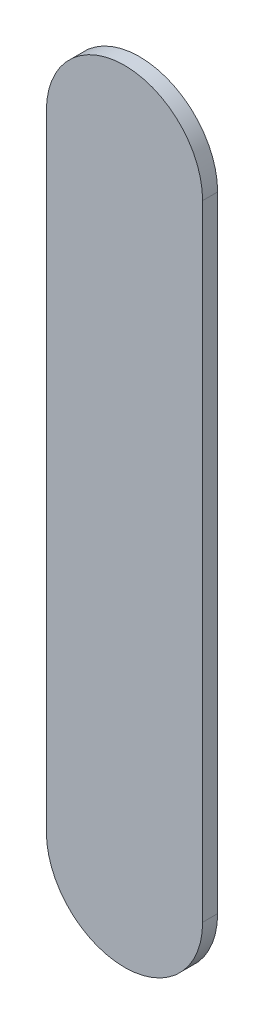
ISO-10303-21;
HEADER;
FILE_DESCRIPTION(('STEP AP214'),'2;1');
FILE_NAME('part.step','',(''),(''),'','','');
FILE_SCHEMA(('AUTOMOTIVE_DESIGN { 1 0 10303 214 1 1 1 1 }'));
ENDSEC;
DATA;
#1=APPLICATION_CONTEXT('core data for automotive mechanical design processes');
#2=APPLICATION_PROTOCOL_DEFINITION('international standard','automotive_design',2000,#1);
#3=PRODUCT_CONTEXT('',#1,'mechanical');
#4=PRODUCT('Part','Part','',(#3));
#5=PRODUCT_RELATED_PRODUCT_CATEGORY('part','',(#4));
#6=PRODUCT_DEFINITION_FORMATION('','',#4);
#7=PRODUCT_DEFINITION_CONTEXT('part definition',#1,'design');
#8=PRODUCT_DEFINITION('design','',#6,#7);
#9=PRODUCT_DEFINITION_SHAPE('','',#8);
#10=(LENGTH_UNIT() NAMED_UNIT(*) SI_UNIT(.MILLI.,.METRE.));
#11=(NAMED_UNIT(*) PLANE_ANGLE_UNIT() SI_UNIT($,.RADIAN.));
#12=(NAMED_UNIT(*) SI_UNIT($,.STERADIAN.) SOLID_ANGLE_UNIT());
#13=UNCERTAINTY_MEASURE_WITH_UNIT(LENGTH_MEASURE(1.E-05),#10,'distance_accuracy_value','');
#14=(GEOMETRIC_REPRESENTATION_CONTEXT(3) GLOBAL_UNCERTAINTY_ASSIGNED_CONTEXT((#13)) GLOBAL_UNIT_ASSIGNED_CONTEXT((#10,
#11,#12)) REPRESENTATION_CONTEXT('',''));
#15=CARTESIAN_POINT('',(0.,0.,0.));
#16=DIRECTION('',(0.,0.,1.));
#17=DIRECTION('',(1.,0.,0.));
#18=AXIS2_PLACEMENT_3D('',#15,#16,#17);
#19=CARTESIAN_POINT('',(0.,12.7,0.6096));
#20=DIRECTION('',(0.,0.,-1.));
#21=DIRECTION('',(-1.,0.,0.));
#22=AXIS2_PLACEMENT_3D('',#19,#20,#21);
#23=CYLINDRICAL_SURFACE('',#22,3.175);
#24=CARTESIAN_POINT('',(0.,12.7,0.));
#25=DIRECTION('',(0.,0.,1.));
#26=DIRECTION('',(1.,0.,0.));
#27=AXIS2_PLACEMENT_3D('',#24,#25,#26);
#28=CIRCLE('',#27,3.175);
#29=CARTESIAN_POINT('',(3.17499999999999,12.7,0.));
#30=VERTEX_POINT('',#29);
#31=CARTESIAN_POINT('',(-3.175,12.7,0.));
#32=VERTEX_POINT('',#31);
#33=EDGE_CURVE('E107',#30,#32,#28,.T.);
#34=ORIENTED_EDGE('',*,*,#33,.T.);
#35=DIRECTION('',(0.,0.,-1.));
#36=VECTOR('',#35,1.);
#37=CARTESIAN_POINT('',(-3.175,12.7,0.6096));
#38=LINE('',#37,#36);
#39=CARTESIAN_POINT('',(-3.175,12.7,0.6096));
#40=VERTEX_POINT('',#39);
#41=EDGE_CURVE('E13',#40,#32,#38,.T.);
#42=ORIENTED_EDGE('',*,*,#41,.F.);
#43=CARTESIAN_POINT('',(0.,12.7,0.6096));
#44=DIRECTION('',(0.,0.,1.));
#45=DIRECTION('',(1.,0.,0.));
#46=AXIS2_PLACEMENT_3D('',#43,#44,#45);
#47=CIRCLE('',#46,3.175);
#48=CARTESIAN_POINT('',(3.17499999999999,12.7,0.6096));
#49=VERTEX_POINT('',#48);
#50=EDGE_CURVE('E95',#49,#40,#47,.T.);
#51=ORIENTED_EDGE('',*,*,#50,.F.);
#52=DIRECTION('',(0.,0.,-1.));
#53=VECTOR('',#52,1.);
#54=CARTESIAN_POINT('',(3.17499999999999,12.7,0.6096));
#55=LINE('',#54,#53);
#56=EDGE_CURVE('E103',#49,#30,#55,.T.);
#57=ORIENTED_EDGE('',*,*,#56,.T.);
#58=EDGE_LOOP('',(#34,#42,#51,#57));
#59=FACE_BOUND('',#58,.T.);
#60=ADVANCED_FACE('F44',(#59),#23,.T.);
#61=CARTESIAN_POINT('',(-3.175,12.7,0.6096));
#62=DIRECTION('',(1.,0.,0.));
#63=DIRECTION('',(0.,1.,0.));
#64=AXIS2_PLACEMENT_3D('',#61,#62,#63);
#65=PLANE('',#64);
#66=DIRECTION('',(0.,-1.,0.));
#67=VECTOR('',#66,1.);
#68=CARTESIAN_POINT('',(-3.175,12.7,0.));
#69=LINE('',#68,#67);
#70=CARTESIAN_POINT('',(-3.175,-12.7,0.));
#71=VERTEX_POINT('',#70);
#72=EDGE_CURVE('E99',#32,#71,#69,.T.);
#73=ORIENTED_EDGE('',*,*,#72,.T.);
#74=DIRECTION('',(0.,0.,-1.));
#75=VECTOR('',#74,1.);
#76=CARTESIAN_POINT('',(-3.175,-12.7,0.6096));
#77=LINE('',#76,#75);
#78=CARTESIAN_POINT('',(-3.175,-12.7,0.6096));
#79=VERTEX_POINT('',#78);
#80=EDGE_CURVE('E52',#79,#71,#77,.T.);
#81=ORIENTED_EDGE('',*,*,#80,.F.);
#82=DIRECTION('',(0.,-1.,0.));
#83=VECTOR('',#82,1.);
#84=CARTESIAN_POINT('',(-3.175,12.7,0.6096));
#85=LINE('',#84,#83);
#86=EDGE_CURVE('E90',#40,#79,#85,.T.);
#87=ORIENTED_EDGE('',*,*,#86,.F.);
#88=ORIENTED_EDGE('',*,*,#41,.T.);
#89=EDGE_LOOP('',(#73,#81,#87,#88));
#90=FACE_BOUND('',#89,.T.);
#91=ADVANCED_FACE('F98',(#90),#65,.F.);
#92=CARTESIAN_POINT('',(0.,-12.7,0.6096));
#93=DIRECTION('',(0.,0.,-1.));
#94=DIRECTION('',(-1.,0.,0.));
#95=AXIS2_PLACEMENT_3D('',#92,#93,#94);
#96=CYLINDRICAL_SURFACE('',#95,3.175);
#97=CARTESIAN_POINT('',(0.,-12.7,0.));
#98=DIRECTION('',(0.,0.,1.));
#99=DIRECTION('',(1.,0.,0.));
#100=AXIS2_PLACEMENT_3D('',#97,#98,#99);
#101=CIRCLE('',#100,3.175);
#102=CARTESIAN_POINT('',(3.175,-12.7,0.));
#103=VERTEX_POINT('',#102);
#104=EDGE_CURVE('E77',#71,#103,#101,.T.);
#105=ORIENTED_EDGE('',*,*,#104,.T.);
#106=DIRECTION('',(0.,0.,-1.));
#107=VECTOR('',#106,1.);
#108=CARTESIAN_POINT('',(3.175,-12.7,0.6096));
#109=LINE('',#108,#107);
#110=CARTESIAN_POINT('',(3.175,-12.7,0.6096));
#111=VERTEX_POINT('',#110);
#112=EDGE_CURVE('E100',#111,#103,#109,.T.);
#113=ORIENTED_EDGE('',*,*,#112,.F.);
#114=CARTESIAN_POINT('',(0.,-12.7,0.6096));
#115=DIRECTION('',(0.,0.,1.));
#116=DIRECTION('',(1.,0.,0.));
#117=AXIS2_PLACEMENT_3D('',#114,#115,#116);
#118=CIRCLE('',#117,3.175);
#119=EDGE_CURVE('E93',#79,#111,#118,.T.);
#120=ORIENTED_EDGE('',*,*,#119,.F.);
#121=ORIENTED_EDGE('',*,*,#80,.T.);
#122=EDGE_LOOP('',(#105,#113,#120,#121));
#123=FACE_BOUND('',#122,.T.);
#124=ADVANCED_FACE('F101',(#123),#96,.T.);
#125=CARTESIAN_POINT('',(3.17499999999999,12.7,0.6096));
#126=DIRECTION('',(-1.,0.,0.));
#127=DIRECTION('',(0.,-1.,0.));
#128=AXIS2_PLACEMENT_3D('',#125,#126,#127);
#129=PLANE('',#128);
#130=DIRECTION('',(0.,1.,0.));
#131=VECTOR('',#130,1.);
#132=CARTESIAN_POINT('',(3.17499999999999,12.7,0.));
#133=LINE('',#132,#131);
#134=EDGE_CURVE('E83',#103,#30,#133,.T.);
#135=ORIENTED_EDGE('',*,*,#134,.T.);
#136=ORIENTED_EDGE('',*,*,#56,.F.);
#137=DIRECTION('',(0.,1.,0.));
#138=VECTOR('',#137,1.);
#139=CARTESIAN_POINT('',(3.17499999999999,12.7,0.6096));
#140=LINE('',#139,#138);
#141=EDGE_CURVE('E60',#111,#49,#140,.T.);
#142=ORIENTED_EDGE('',*,*,#141,.F.);
#143=ORIENTED_EDGE('',*,*,#112,.T.);
#144=EDGE_LOOP('',(#135,#136,#142,#143));
#145=FACE_BOUND('',#144,.T.);
#146=ADVANCED_FACE('F114',(#145),#129,.F.);
#147=CARTESIAN_POINT('',(0.,12.7,0.6096));
#148=DIRECTION('',(0.,0.,1.));
#149=DIRECTION('',(1.,0.,0.));
#150=AXIS2_PLACEMENT_3D('',#147,#148,#149);
#151=PLANE('',#150);
#152=ORIENTED_EDGE('',*,*,#50,.T.);
#153=ORIENTED_EDGE('',*,*,#86,.T.);
#154=ORIENTED_EDGE('',*,*,#119,.T.);
#155=ORIENTED_EDGE('',*,*,#141,.T.);
#156=EDGE_LOOP('',(#152,#153,#154,#155));
#157=FACE_BOUND('',#156,.T.);
#158=ADVANCED_FACE('F91',(#157),#151,.T.);
#159=CARTESIAN_POINT('',(0.,12.7,0.));
#160=DIRECTION('',(0.,0.,1.));
#161=DIRECTION('',(1.,0.,0.));
#162=AXIS2_PLACEMENT_3D('',#159,#160,#161);
#163=PLANE('',#162);
#164=ORIENTED_EDGE('',*,*,#33,.F.);
#165=ORIENTED_EDGE('',*,*,#134,.F.);
#166=ORIENTED_EDGE('',*,*,#104,.F.);
#167=ORIENTED_EDGE('',*,*,#72,.F.);
#168=EDGE_LOOP('',(#164,#165,#166,#167));
#169=FACE_BOUND('',#168,.T.);
#170=ADVANCED_FACE('F117',(#169),#163,.F.);
#171=CLOSED_SHELL('',(#60,#91,#124,#146,#158,#170));
#172=MANIFOLD_SOLID_BREP('B2',#171);
#173=ADVANCED_BREP_SHAPE_REPRESENTATION('',(#18,#172),#14);
#174=SHAPE_DEFINITION_REPRESENTATION(#9,#173);
ENDSEC;
END-ISO-10303-21;
